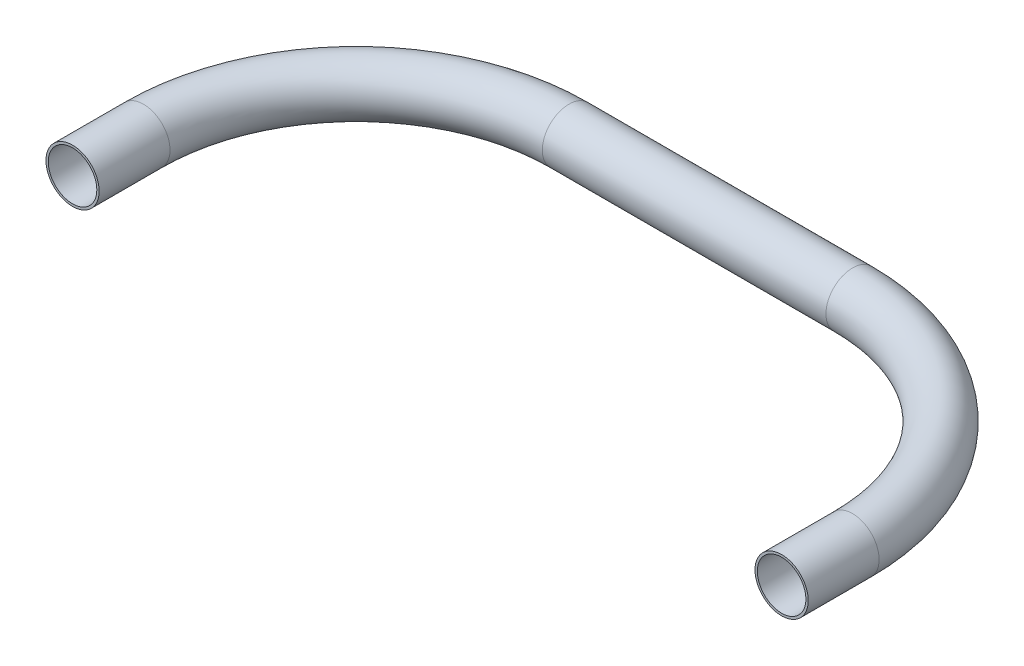
ISO-10303-21;
HEADER;
FILE_DESCRIPTION(('STEP AP214'),'2;1');
FILE_NAME('part.step','',(''),(''),'','','');
FILE_SCHEMA(('AUTOMOTIVE_DESIGN { 1 0 10303 214 1 1 1 1 }'));
ENDSEC;
DATA;
#1=APPLICATION_CONTEXT('core data for automotive mechanical design processes');
#2=APPLICATION_PROTOCOL_DEFINITION('international standard','automotive_design',2000,#1);
#3=PRODUCT_CONTEXT('',#1,'mechanical');
#4=PRODUCT('Part','Part','',(#3));
#5=PRODUCT_RELATED_PRODUCT_CATEGORY('part','',(#4));
#6=PRODUCT_DEFINITION_FORMATION('','',#4);
#7=PRODUCT_DEFINITION_CONTEXT('part definition',#1,'design');
#8=PRODUCT_DEFINITION('design','',#6,#7);
#9=PRODUCT_DEFINITION_SHAPE('','',#8);
#10=(LENGTH_UNIT() NAMED_UNIT(*) SI_UNIT(.MILLI.,.METRE.));
#11=(NAMED_UNIT(*) PLANE_ANGLE_UNIT() SI_UNIT($,.RADIAN.));
#12=(NAMED_UNIT(*) SI_UNIT($,.STERADIAN.) SOLID_ANGLE_UNIT());
#13=UNCERTAINTY_MEASURE_WITH_UNIT(LENGTH_MEASURE(1.E-05),#10,'distance_accuracy_value','');
#14=(GEOMETRIC_REPRESENTATION_CONTEXT(3) GLOBAL_UNCERTAINTY_ASSIGNED_CONTEXT((#13)) GLOBAL_UNIT_ASSIGNED_CONTEXT((#10,
#11,#12)) REPRESENTATION_CONTEXT('',''));
#15=CARTESIAN_POINT('',(0.,0.,0.));
#16=DIRECTION('',(0.,0.,1.));
#17=DIRECTION('',(1.,0.,0.));
#18=AXIS2_PLACEMENT_3D('',#15,#16,#17);
#19=CARTESIAN_POINT('',(0.,0.,0.));
#20=DIRECTION('',(0.,0.,-1.));
#21=DIRECTION('',(-1.,0.,0.));
#22=AXIS2_PLACEMENT_3D('',#19,#20,#21);
#23=CYLINDRICAL_SURFACE('',#22,19.05);
#24=CARTESIAN_POINT('',(0.,0.,-50.7999999999989));
#25=DIRECTION('',(0.,0.,-1.));
#26=DIRECTION('',(-1.,0.,0.));
#27=AXIS2_PLACEMENT_3D('',#24,#25,#26);
#28=CIRCLE('',#27,19.05);
#29=CARTESIAN_POINT('',(19.05,0.,-50.7999999999987));
#30=VERTEX_POINT('',#29);
#31=EDGE_CURVE('E81',#30,#30,#28,.T.);
#32=ORIENTED_EDGE('',*,*,#31,.F.);
#33=EDGE_LOOP('',(#32));
#34=FACE_BOUND('',#33,.T.);
#35=CARTESIAN_POINT('',(0.,0.,0.));
#36=DIRECTION('',(0.,0.,-1.));
#37=DIRECTION('',(-1.,0.,0.));
#38=AXIS2_PLACEMENT_3D('',#35,#36,#37);
#39=CIRCLE('',#38,19.05);
#40=CARTESIAN_POINT('',(-19.05,0.,0.));
#41=VERTEX_POINT('',#40);
#42=EDGE_CURVE('E48',#41,#41,#39,.T.);
#43=ORIENTED_EDGE('',*,*,#42,.T.);
#44=EDGE_LOOP('',(#43));
#45=FACE_BOUND('',#44,.T.);
#46=ADVANCED_FACE('F33',(#34,#45),#23,.T.);
#47=CARTESIAN_POINT('',(-152.4,0.,-50.8));
#48=DIRECTION('',(0.,1.,0.));
#49=DIRECTION('',(0.,0.,1.));
#50=AXIS2_PLACEMENT_3D('',#47,#48,#49);
#51=TOROIDAL_SURFACE('',#50,152.4,19.05);
#52=CARTESIAN_POINT('',(-152.400000000001,0.,-203.2));
#53=DIRECTION('',(-1.,0.,0.));
#54=DIRECTION('',(0.,0.,1.));
#55=AXIS2_PLACEMENT_3D('',#52,#53,#54);
#56=CIRCLE('',#55,19.05);
#57=CARTESIAN_POINT('',(-152.400000000001,0.,-222.25));
#58=VERTEX_POINT('',#57);
#59=EDGE_CURVE('E84',#58,#58,#56,.T.);
#60=CARTESIAN_POINT('',(-152.4,0.,-50.8));
#61=DIRECTION('',(0.,1.,0.));
#62=DIRECTION('',(0.,0.,1.));
#63=AXIS2_PLACEMENT_3D('',#60,#61,#62);
#64=CIRCLE('',#63,171.45);
#65=EDGE_CURVE('',#30,#58,#64,.T.);
#66=ORIENTED_EDGE('',*,*,#31,.T.);
#67=ORIENTED_EDGE('',*,*,#59,.F.);
#68=ORIENTED_EDGE('',*,*,#65,.T.);
#69=ORIENTED_EDGE('',*,*,#65,.F.);
#70=EDGE_LOOP('',(#66,#68,#67,#69));
#71=FACE_BOUND('',#70,.T.);
#72=ADVANCED_FACE('F102',(#71),#51,.T.);
#73=CARTESIAN_POINT('',(-152.400000000001,0.,-203.2));
#74=DIRECTION('',(-1.,0.,0.));
#75=DIRECTION('',(0.,0.,1.));
#76=AXIS2_PLACEMENT_3D('',#73,#74,#75);
#77=CYLINDRICAL_SURFACE('',#76,19.05);
#78=CARTESIAN_POINT('',(-355.599999999999,0.,-203.2));
#79=DIRECTION('',(-1.,0.,0.));
#80=DIRECTION('',(0.,0.,1.));
#81=AXIS2_PLACEMENT_3D('',#78,#79,#80);
#82=CIRCLE('',#81,19.05);
#83=CARTESIAN_POINT('',(-355.599999999999,0.,-222.25));
#84=VERTEX_POINT('',#83);
#85=EDGE_CURVE('E86',#84,#84,#82,.T.);
#86=ORIENTED_EDGE('',*,*,#85,.F.);
#87=EDGE_LOOP('',(#86));
#88=FACE_BOUND('',#87,.T.);
#89=ORIENTED_EDGE('',*,*,#59,.T.);
#90=EDGE_LOOP('',(#89));
#91=FACE_BOUND('',#90,.T.);
#92=ADVANCED_FACE('F96',(#88,#91),#77,.T.);
#93=CARTESIAN_POINT('',(-355.6,0.,-50.8));
#94=DIRECTION('',(0.,1.,0.));
#95=DIRECTION('',(0.,0.,1.));
#96=AXIS2_PLACEMENT_3D('',#93,#94,#95);
#97=TOROIDAL_SURFACE('',#96,152.4,19.05);
#98=CARTESIAN_POINT('',(-508.,0.,-50.8000000000024));
#99=DIRECTION('',(0.,0.,1.));
#100=DIRECTION('',(1.,0.,0.));
#101=AXIS2_PLACEMENT_3D('',#98,#99,#100);
#102=CIRCLE('',#101,19.05);
#103=CARTESIAN_POINT('',(-527.05,0.,-50.8000000000028));
#104=VERTEX_POINT('',#103);
#105=EDGE_CURVE('E37',#104,#104,#102,.T.);
#106=CARTESIAN_POINT('',(-355.6,0.,-50.8));
#107=DIRECTION('',(0.,1.,0.));
#108=DIRECTION('',(0.,0.,1.));
#109=AXIS2_PLACEMENT_3D('',#106,#107,#108);
#110=CIRCLE('',#109,171.45);
#111=EDGE_CURVE('',#84,#104,#110,.T.);
#112=ORIENTED_EDGE('',*,*,#85,.T.);
#113=ORIENTED_EDGE('',*,*,#105,.F.);
#114=ORIENTED_EDGE('',*,*,#111,.T.);
#115=ORIENTED_EDGE('',*,*,#111,.F.);
#116=EDGE_LOOP('',(#112,#114,#113,#115));
#117=FACE_BOUND('',#116,.T.);
#118=ADVANCED_FACE('F94',(#117),#97,.T.);
#119=CARTESIAN_POINT('',(-508.,0.,-50.7999999999989));
#120=DIRECTION('',(0.,0.,1.));
#121=DIRECTION('',(1.,0.,0.));
#122=AXIS2_PLACEMENT_3D('',#119,#120,#121);
#123=CYLINDRICAL_SURFACE('',#122,19.05);
#124=CARTESIAN_POINT('',(-508.,0.,0.));
#125=DIRECTION('',(0.,0.,1.));
#126=DIRECTION('',(1.,0.,0.));
#127=AXIS2_PLACEMENT_3D('',#124,#125,#126);
#128=CIRCLE('',#127,19.05);
#129=CARTESIAN_POINT('',(-488.95,0.,0.));
#130=VERTEX_POINT('',#129);
#131=EDGE_CURVE('E53',#130,#130,#128,.T.);
#132=ORIENTED_EDGE('',*,*,#131,.F.);
#133=EDGE_LOOP('',(#132));
#134=FACE_BOUND('',#133,.T.);
#135=ORIENTED_EDGE('',*,*,#105,.T.);
#136=EDGE_LOOP('',(#135));
#137=FACE_BOUND('',#136,.T.);
#138=ADVANCED_FACE('F35',(#134,#137),#123,.T.);
#139=CARTESIAN_POINT('',(0.,0.,0.));
#140=DIRECTION('',(0.,0.,-1.));
#141=DIRECTION('',(-1.,0.,0.));
#142=AXIS2_PLACEMENT_3D('',#139,#140,#141);
#143=PLANE('',#142);
#144=CARTESIAN_POINT('',(0.,0.,0.));
#145=DIRECTION('',(0.,0.,-1.));
#146=DIRECTION('',(-1.,0.,0.));
#147=AXIS2_PLACEMENT_3D('',#144,#145,#146);
#148=CIRCLE('',#147,17.399);
#149=CARTESIAN_POINT('',(-17.399,0.,0.));
#150=VERTEX_POINT('',#149);
#151=EDGE_CURVE('E79',#150,#150,#148,.F.);
#152=ORIENTED_EDGE('',*,*,#151,.F.);
#153=EDGE_LOOP('',(#152));
#154=FACE_BOUND('',#153,.T.);
#155=ORIENTED_EDGE('',*,*,#42,.F.);
#156=EDGE_LOOP('',(#155));
#157=FACE_BOUND('',#156,.T.);
#158=ADVANCED_FACE('F101',(#154,#157),#143,.F.);
#159=CARTESIAN_POINT('',(-508.,0.,0.));
#160=DIRECTION('',(0.,0.,1.));
#161=DIRECTION('',(1.,0.,0.));
#162=AXIS2_PLACEMENT_3D('',#159,#160,#161);
#163=PLANE('',#162);
#164=CARTESIAN_POINT('',(-508.,0.,0.));
#165=DIRECTION('',(0.,0.,1.));
#166=DIRECTION('',(1.,0.,0.));
#167=AXIS2_PLACEMENT_3D('',#164,#165,#166);
#168=CIRCLE('',#167,17.399);
#169=CARTESIAN_POINT('',(-490.601,0.,0.));
#170=VERTEX_POINT('',#169);
#171=EDGE_CURVE('E11',#170,#170,#168,.F.);
#172=ORIENTED_EDGE('',*,*,#171,.T.);
#173=EDGE_LOOP('',(#172));
#174=FACE_BOUND('',#173,.T.);
#175=ORIENTED_EDGE('',*,*,#131,.T.);
#176=EDGE_LOOP('',(#175));
#177=FACE_BOUND('',#176,.T.);
#178=ADVANCED_FACE('F60',(#174,#177),#163,.T.);
#179=CARTESIAN_POINT('',(0.,0.,0.));
#180=DIRECTION('',(0.,0.,-1.));
#181=DIRECTION('',(-1.,0.,0.));
#182=AXIS2_PLACEMENT_3D('',#179,#180,#181);
#183=CYLINDRICAL_SURFACE('',#182,17.399);
#184=CARTESIAN_POINT('',(0.,0.,-50.7999999999989));
#185=DIRECTION('',(0.,0.,-1.));
#186=DIRECTION('',(-1.,0.,0.));
#187=AXIS2_PLACEMENT_3D('',#184,#185,#186);
#188=CIRCLE('',#187,17.399);
#189=CARTESIAN_POINT('',(17.399,0.,-50.7999999999987));
#190=VERTEX_POINT('',#189);
#191=EDGE_CURVE('E135',#190,#190,#188,.F.);
#192=ORIENTED_EDGE('',*,*,#191,.F.);
#193=EDGE_LOOP('',(#192));
#194=FACE_BOUND('',#193,.T.);
#195=ORIENTED_EDGE('',*,*,#151,.T.);
#196=EDGE_LOOP('',(#195));
#197=FACE_BOUND('',#196,.T.);
#198=ADVANCED_FACE('F116',(#194,#197),#183,.F.);
#199=CARTESIAN_POINT('',(-152.4,0.,-50.8));
#200=DIRECTION('',(0.,1.,0.));
#201=DIRECTION('',(0.,0.,1.));
#202=AXIS2_PLACEMENT_3D('',#199,#200,#201);
#203=TOROIDAL_SURFACE('',#202,152.4,17.399);
#204=CARTESIAN_POINT('',(-152.400000000001,0.,-203.2));
#205=DIRECTION('',(-1.,0.,0.));
#206=DIRECTION('',(0.,0.,1.));
#207=AXIS2_PLACEMENT_3D('',#204,#205,#206);
#208=CIRCLE('',#207,17.399);
#209=CARTESIAN_POINT('',(-152.400000000001,0.,-220.599));
#210=VERTEX_POINT('',#209);
#211=EDGE_CURVE('E74',#210,#210,#208,.F.);
#212=CARTESIAN_POINT('',(-152.4,0.,-50.8));
#213=DIRECTION('',(0.,1.,0.));
#214=DIRECTION('',(0.,0.,1.));
#215=AXIS2_PLACEMENT_3D('',#212,#213,#214);
#216=CIRCLE('',#215,169.799);
#217=EDGE_CURVE('',#190,#210,#216,.T.);
#218=ORIENTED_EDGE('',*,*,#191,.T.);
#219=ORIENTED_EDGE('',*,*,#211,.F.);
#220=ORIENTED_EDGE('',*,*,#217,.T.);
#221=ORIENTED_EDGE('',*,*,#217,.F.);
#222=EDGE_LOOP('',(#218,#220,#219,#221));
#223=FACE_BOUND('',#222,.T.);
#224=ADVANCED_FACE('F123',(#223),#203,.F.);
#225=CARTESIAN_POINT('',(-152.400000000001,0.,-203.2));
#226=DIRECTION('',(-1.,0.,0.));
#227=DIRECTION('',(0.,0.,1.));
#228=AXIS2_PLACEMENT_3D('',#225,#226,#227);
#229=CYLINDRICAL_SURFACE('',#228,17.399);
#230=CARTESIAN_POINT('',(-355.599999999999,0.,-203.2));
#231=DIRECTION('',(-1.,0.,0.));
#232=DIRECTION('',(0.,0.,1.));
#233=AXIS2_PLACEMENT_3D('',#230,#231,#232);
#234=CIRCLE('',#233,17.399);
#235=CARTESIAN_POINT('',(-355.599999999999,0.,-220.599));
#236=VERTEX_POINT('',#235);
#237=EDGE_CURVE('E71',#236,#236,#234,.F.);
#238=ORIENTED_EDGE('',*,*,#237,.F.);
#239=EDGE_LOOP('',(#238));
#240=FACE_BOUND('',#239,.T.);
#241=ORIENTED_EDGE('',*,*,#211,.T.);
#242=EDGE_LOOP('',(#241));
#243=FACE_BOUND('',#242,.T.);
#244=ADVANCED_FACE('F120',(#240,#243),#229,.F.);
#245=CARTESIAN_POINT('',(-355.6,0.,-50.8));
#246=DIRECTION('',(0.,1.,0.));
#247=DIRECTION('',(0.,0.,1.));
#248=AXIS2_PLACEMENT_3D('',#245,#246,#247);
#249=TOROIDAL_SURFACE('',#248,152.4,17.399);
#250=CARTESIAN_POINT('',(-508.,0.,-50.8000000000024));
#251=DIRECTION('',(0.,0.,1.));
#252=DIRECTION('',(1.,0.,0.));
#253=AXIS2_PLACEMENT_3D('',#250,#251,#252);
#254=CIRCLE('',#253,17.399);
#255=CARTESIAN_POINT('',(-525.399,0.,-50.8000000000027));
#256=VERTEX_POINT('',#255);
#257=EDGE_CURVE('E42',#256,#256,#254,.F.);
#258=CARTESIAN_POINT('',(-355.6,0.,-50.8));
#259=DIRECTION('',(0.,1.,0.));
#260=DIRECTION('',(0.,0.,1.));
#261=AXIS2_PLACEMENT_3D('',#258,#259,#260);
#262=CIRCLE('',#261,169.799);
#263=EDGE_CURVE('',#236,#256,#262,.T.);
#264=ORIENTED_EDGE('',*,*,#237,.T.);
#265=ORIENTED_EDGE('',*,*,#257,.F.);
#266=ORIENTED_EDGE('',*,*,#263,.T.);
#267=ORIENTED_EDGE('',*,*,#263,.F.);
#268=EDGE_LOOP('',(#264,#266,#265,#267));
#269=FACE_BOUND('',#268,.T.);
#270=ADVANCED_FACE('F66',(#269),#249,.F.);
#271=CARTESIAN_POINT('',(-508.,0.,-50.7999999999989));
#272=DIRECTION('',(0.,0.,1.));
#273=DIRECTION('',(1.,0.,0.));
#274=AXIS2_PLACEMENT_3D('',#271,#272,#273);
#275=CYLINDRICAL_SURFACE('',#274,17.399);
#276=ORIENTED_EDGE('',*,*,#171,.F.);
#277=EDGE_LOOP('',(#276));
#278=FACE_BOUND('',#277,.T.);
#279=ORIENTED_EDGE('',*,*,#257,.T.);
#280=EDGE_LOOP('',(#279));
#281=FACE_BOUND('',#280,.T.);
#282=ADVANCED_FACE('F63',(#278,#281),#275,.F.);
#283=CLOSED_SHELL('',(#46,#72,#92,#118,#138,#158,#178,#198,#224,#244,#270,#282));
#284=MANIFOLD_SOLID_BREP('B2',#283);
#285=ADVANCED_BREP_SHAPE_REPRESENTATION('',(#18,#284),#14);
#286=SHAPE_DEFINITION_REPRESENTATION(#9,#285);
ENDSEC;
END-ISO-10303-21;
